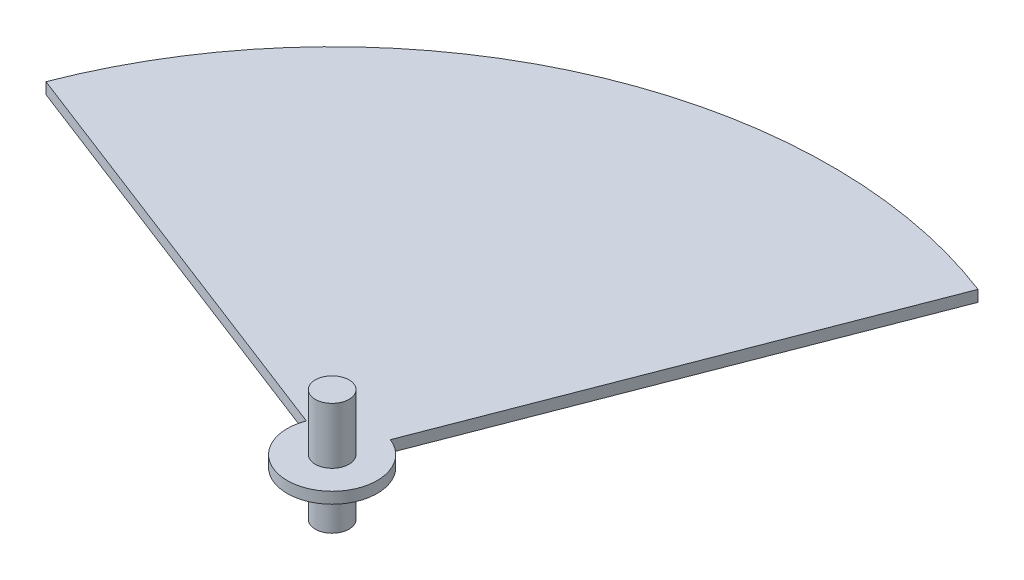
ISO-10303-21;
HEADER;
FILE_DESCRIPTION(('STEP AP214'),'2;1');
FILE_NAME('part.step','',(''),(''),'','','');
FILE_SCHEMA(('AUTOMOTIVE_DESIGN { 1 0 10303 214 1 1 1 1 }'));
ENDSEC;
DATA;
#1=APPLICATION_CONTEXT('core data for automotive mechanical design processes');
#2=APPLICATION_PROTOCOL_DEFINITION('international standard','automotive_design',2000,#1);
#3=PRODUCT_CONTEXT('',#1,'mechanical');
#4=PRODUCT('Part','Part','',(#3));
#5=PRODUCT_RELATED_PRODUCT_CATEGORY('part','',(#4));
#6=PRODUCT_DEFINITION_FORMATION('','',#4);
#7=PRODUCT_DEFINITION_CONTEXT('part definition',#1,'design');
#8=PRODUCT_DEFINITION('design','',#6,#7);
#9=PRODUCT_DEFINITION_SHAPE('','',#8);
#10=(LENGTH_UNIT() NAMED_UNIT(*) SI_UNIT(.MILLI.,.METRE.));
#11=(NAMED_UNIT(*) PLANE_ANGLE_UNIT() SI_UNIT($,.RADIAN.));
#12=(NAMED_UNIT(*) SI_UNIT($,.STERADIAN.) SOLID_ANGLE_UNIT());
#13=UNCERTAINTY_MEASURE_WITH_UNIT(LENGTH_MEASURE(1.E-05),#10,'distance_accuracy_value','');
#14=(GEOMETRIC_REPRESENTATION_CONTEXT(3) GLOBAL_UNCERTAINTY_ASSIGNED_CONTEXT((#13)) GLOBAL_UNIT_ASSIGNED_CONTEXT((#10,
#11,#12)) REPRESENTATION_CONTEXT('',''));
#15=CARTESIAN_POINT('',(0.,0.,0.));
#16=DIRECTION('',(0.,0.,1.));
#17=DIRECTION('',(1.,0.,0.));
#18=AXIS2_PLACEMENT_3D('',#15,#16,#17);
#19=CARTESIAN_POINT('',(225.,547.5,-225.));
#20=DIRECTION('',(0.,-1.,0.));
#21=DIRECTION('',(0.,0.,-1.));
#22=AXIS2_PLACEMENT_3D('',#19,#20,#21);
#23=CYLINDRICAL_SURFACE('',#22,7.50000000000001);
#24=CARTESIAN_POINT('',(225.,522.5,-225.));
#25=DIRECTION('',(0.,1.,0.));
#26=DIRECTION('',(0.,0.,1.));
#27=AXIS2_PLACEMENT_3D('',#24,#25,#26);
#28=CIRCLE('',#27,7.50000000000001);
#29=CARTESIAN_POINT('',(225.,522.5,-217.5));
#30=VERTEX_POINT('',#29);
#31=EDGE_CURVE('E43',#30,#30,#28,.T.);
#32=ORIENTED_EDGE('',*,*,#31,.T.);
#33=EDGE_LOOP('',(#32));
#34=FACE_BOUND('',#33,.T.);
#35=CARTESIAN_POINT('',(225.,547.5,-225.));
#36=DIRECTION('',(0.,1.,0.));
#37=DIRECTION('',(0.,0.,1.));
#38=AXIS2_PLACEMENT_3D('',#35,#36,#37);
#39=CIRCLE('',#38,7.50000000000001);
#40=CARTESIAN_POINT('',(225.,547.5,-217.5));
#41=VERTEX_POINT('',#40);
#42=EDGE_CURVE('E49',#41,#41,#39,.T.);
#43=ORIENTED_EDGE('',*,*,#42,.F.);
#44=EDGE_LOOP('',(#43));
#45=FACE_BOUND('',#44,.T.);
#46=ADVANCED_FACE('F40',(#34,#45),#23,.T.);
#47=CARTESIAN_POINT('',(225.,547.5,-225.));
#48=DIRECTION('',(0.,1.,0.));
#49=DIRECTION('',(0.,0.,1.));
#50=AXIS2_PLACEMENT_3D('',#47,#48,#49);
#51=PLANE('',#50);
#52=ORIENTED_EDGE('',*,*,#42,.T.);
#53=EDGE_LOOP('',(#52));
#54=FACE_BOUND('',#53,.T.);
#55=ADVANCED_FACE('F141',(#54),#51,.T.);
#56=CARTESIAN_POINT('',(225.,522.5,-225.));
#57=DIRECTION('',(0.,-1.,0.));
#58=DIRECTION('',(0.,0.,-1.));
#59=AXIS2_PLACEMENT_3D('',#56,#57,#58);
#60=CYLINDRICAL_SURFACE('',#59,222.);
#61=CARTESIAN_POINT('',(225.,517.5,-225.));
#62=DIRECTION('',(0.,1.,0.));
#63=DIRECTION('',(0.,0.,1.));
#64=AXIS2_PLACEMENT_3D('',#61,#62,#63);
#65=CIRCLE('',#64,222.);
#66=CARTESIAN_POINT('',(304.932555116059,517.5,-432.110566202254));
#67=VERTEX_POINT('',#66);
#68=CARTESIAN_POINT('',(17.8894333504933,517.5,-304.932553957197));
#69=VERTEX_POINT('',#68);
#70=EDGE_CURVE('E108',#67,#69,#65,.T.);
#71=ORIENTED_EDGE('',*,*,#70,.T.);
#72=DIRECTION('',(0.,-1.,0.));
#73=VECTOR('',#72,1.);
#74=CARTESIAN_POINT('',(17.8894333504933,522.5,-304.932553957197));
#75=LINE('',#74,#73);
#76=CARTESIAN_POINT('',(17.8894333504933,522.5,-304.932553957197));
#77=VERTEX_POINT('',#76);
#78=EDGE_CURVE('E99',#77,#69,#75,.T.);
#79=ORIENTED_EDGE('',*,*,#78,.F.);
#80=CARTESIAN_POINT('',(225.,522.5,-225.));
#81=DIRECTION('',(0.,1.,0.));
#82=DIRECTION('',(0.,0.,1.));
#83=AXIS2_PLACEMENT_3D('',#80,#81,#82);
#84=CIRCLE('',#83,222.);
#85=CARTESIAN_POINT('',(304.932555116059,522.5,-432.110566202254));
#86=VERTEX_POINT('',#85);
#87=EDGE_CURVE('E93',#86,#77,#84,.T.);
#88=ORIENTED_EDGE('',*,*,#87,.F.);
#89=DIRECTION('',(0.,-1.,0.));
#90=VECTOR('',#89,1.);
#91=CARTESIAN_POINT('',(304.932555116059,522.5,-432.110566202254));
#92=LINE('',#91,#90);
#93=EDGE_CURVE('E104',#86,#67,#92,.T.);
#94=ORIENTED_EDGE('',*,*,#93,.T.);
#95=EDGE_LOOP('',(#71,#79,#88,#94));
#96=FACE_BOUND('',#95,.T.);
#97=ADVANCED_FACE('F146',(#96),#60,.T.);
#98=CARTESIAN_POINT('',(206.341386692873,522.5,-232.201132414757));
#99=DIRECTION('',(0.360056549356744,0.,-0.932930480403183));
#100=DIRECTION('',(-0.932930480403183,0.,-0.360056549356744));
#101=AXIS2_PLACEMENT_3D('',#98,#99,#100);
#102=PLANE('',#101);
#103=DIRECTION('',(0.932930480403183,0.,0.360056549356744));
#104=VECTOR('',#103,1.);
#105=CARTESIAN_POINT('',(206.341386692873,517.5,-232.201132414757));
#106=LINE('',#105,#104);
#107=CARTESIAN_POINT('',(206.341386692873,517.5,-232.201132414757));
#108=VERTEX_POINT('',#107);
#109=EDGE_CURVE('E98',#69,#108,#106,.T.);
#110=ORIENTED_EDGE('',*,*,#109,.T.);
#111=DIRECTION('',(0.,-1.,0.));
#112=VECTOR('',#111,1.);
#113=CARTESIAN_POINT('',(206.341386692873,522.5,-232.201132414757));
#114=LINE('',#113,#112);
#115=CARTESIAN_POINT('',(206.341386692873,522.5,-232.201132414757));
#116=VERTEX_POINT('',#115);
#117=EDGE_CURVE('E96',#116,#108,#114,.T.);
#118=ORIENTED_EDGE('',*,*,#117,.F.);
#119=DIRECTION('',(0.932930480403183,0.,0.360056549356744));
#120=VECTOR('',#119,1.);
#121=CARTESIAN_POINT('',(206.341386692873,522.5,-232.201132414757));
#122=LINE('',#121,#120);
#123=EDGE_CURVE('E88',#77,#116,#122,.T.);
#124=ORIENTED_EDGE('',*,*,#123,.F.);
#125=ORIENTED_EDGE('',*,*,#78,.T.);
#126=EDGE_LOOP('',(#110,#118,#124,#125));
#127=FACE_BOUND('',#126,.T.);
#128=ADVANCED_FACE('F97',(#127),#102,.F.);
#129=CARTESIAN_POINT('',(225.,522.5,-225.));
#130=DIRECTION('',(0.,-1.,0.));
#131=DIRECTION('',(0.,0.,-1.));
#132=AXIS2_PLACEMENT_3D('',#129,#130,#131);
#133=CYLINDRICAL_SURFACE('',#132,20.0000039649945);
#134=CARTESIAN_POINT('',(225.,517.5,-225.));
#135=DIRECTION('',(0.,1.,0.));
#136=DIRECTION('',(0.,0.,1.));
#137=AXIS2_PLACEMENT_3D('',#134,#135,#136);
#138=CIRCLE('',#137,20.0000039649945);
#139=CARTESIAN_POINT('',(232.201132519159,517.5,-243.658613266835));
#140=VERTEX_POINT('',#139);
#141=EDGE_CURVE('E74',#108,#140,#138,.T.);
#142=ORIENTED_EDGE('',*,*,#141,.T.);
#143=DIRECTION('',(0.,-1.,0.));
#144=VECTOR('',#143,1.);
#145=CARTESIAN_POINT('',(232.201132519159,522.5,-243.658613266835));
#146=LINE('',#145,#144);
#147=CARTESIAN_POINT('',(232.201132519159,522.5,-243.658613266835));
#148=VERTEX_POINT('',#147);
#149=EDGE_CURVE('E100',#148,#140,#146,.T.);
#150=ORIENTED_EDGE('',*,*,#149,.F.);
#151=CARTESIAN_POINT('',(225.,522.5,-225.));
#152=DIRECTION('',(0.,1.,0.));
#153=DIRECTION('',(0.,0.,1.));
#154=AXIS2_PLACEMENT_3D('',#151,#152,#153);
#155=CIRCLE('',#154,20.0000039649945);
#156=EDGE_CURVE('E91',#116,#148,#155,.T.);
#157=ORIENTED_EDGE('',*,*,#156,.F.);
#158=ORIENTED_EDGE('',*,*,#117,.T.);
#159=EDGE_LOOP('',(#142,#150,#157,#158));
#160=FACE_BOUND('',#159,.T.);
#161=ADVANCED_FACE('F102',(#160),#133,.T.);
#162=CARTESIAN_POINT('',(232.201132519159,522.5,-243.658613266836));
#163=DIRECTION('',(-0.93293047838853,0.,-0.360056554576844));
#164=DIRECTION('',(-0.360056554576844,0.,0.93293047838853));
#165=AXIS2_PLACEMENT_3D('',#162,#163,#164);
#166=PLANE('',#165);
#167=DIRECTION('',(0.360056554576844,0.,-0.93293047838853));
#168=VECTOR('',#167,1.);
#169=CARTESIAN_POINT('',(232.201132519159,517.5,-243.658613266836));
#170=LINE('',#169,#168);
#171=EDGE_CURVE('E80',#140,#67,#170,.T.);
#172=ORIENTED_EDGE('',*,*,#171,.T.);
#173=ORIENTED_EDGE('',*,*,#93,.F.);
#174=DIRECTION('',(0.360056554576844,0.,-0.93293047838853));
#175=VECTOR('',#174,1.);
#176=CARTESIAN_POINT('',(232.201132519159,522.5,-243.658613266836));
#177=LINE('',#176,#175);
#178=EDGE_CURVE('E57',#148,#86,#177,.T.);
#179=ORIENTED_EDGE('',*,*,#178,.F.);
#180=ORIENTED_EDGE('',*,*,#149,.T.);
#181=EDGE_LOOP('',(#172,#173,#179,#180));
#182=FACE_BOUND('',#181,.T.);
#183=ADVANCED_FACE('F130',(#182),#166,.F.);
#184=CARTESIAN_POINT('',(225.,522.5,-225.));
#185=DIRECTION('',(0.,1.,0.));
#186=DIRECTION('',(0.,0.,1.));
#187=AXIS2_PLACEMENT_3D('',#184,#185,#186);
#188=PLANE('',#187);
#189=ORIENTED_EDGE('',*,*,#31,.F.);
#190=EDGE_LOOP('',(#189));
#191=FACE_BOUND('',#190,.T.);
#192=ORIENTED_EDGE('',*,*,#87,.T.);
#193=ORIENTED_EDGE('',*,*,#123,.T.);
#194=ORIENTED_EDGE('',*,*,#156,.T.);
#195=ORIENTED_EDGE('',*,*,#178,.T.);
#196=EDGE_LOOP('',(#192,#193,#194,#195));
#197=FACE_BOUND('',#196,.T.);
#198=ADVANCED_FACE('F89',(#191,#197),#188,.T.);
#199=CARTESIAN_POINT('',(225.,517.5,-225.));
#200=DIRECTION('',(0.,1.,0.));
#201=DIRECTION('',(0.,0.,1.));
#202=AXIS2_PLACEMENT_3D('',#199,#200,#201);
#203=PLANE('',#202);
#204=CARTESIAN_POINT('',(225.,517.5,-225.));
#205=DIRECTION('',(0.,1.,0.));
#206=DIRECTION('',(0.,0.,1.));
#207=AXIS2_PLACEMENT_3D('',#204,#205,#206);
#208=CIRCLE('',#207,7.50000000000001);
#209=CARTESIAN_POINT('',(225.,517.5,-217.5));
#210=VERTEX_POINT('',#209);
#211=EDGE_CURVE('E11',#210,#210,#208,.T.);
#212=ORIENTED_EDGE('',*,*,#211,.T.);
#213=EDGE_LOOP('',(#212));
#214=FACE_BOUND('',#213,.T.);
#215=ORIENTED_EDGE('',*,*,#70,.F.);
#216=ORIENTED_EDGE('',*,*,#171,.F.);
#217=ORIENTED_EDGE('',*,*,#141,.F.);
#218=ORIENTED_EDGE('',*,*,#109,.F.);
#219=EDGE_LOOP('',(#215,#216,#217,#218));
#220=FACE_BOUND('',#219,.T.);
#221=ADVANCED_FACE('F129',(#214,#220),#203,.F.);
#222=CARTESIAN_POINT('',(225.,497.5,-225.));
#223=DIRECTION('',(0.,1.,0.));
#224=DIRECTION('',(0.,0.,1.));
#225=AXIS2_PLACEMENT_3D('',#222,#223,#224);
#226=PLANE('',#225);
#227=CARTESIAN_POINT('',(225.,497.5,-225.));
#228=DIRECTION('',(0.,1.,0.));
#229=DIRECTION('',(0.,0.,1.));
#230=AXIS2_PLACEMENT_3D('',#227,#228,#229);
#231=CIRCLE('',#230,7.50000000000001);
#232=CARTESIAN_POINT('',(225.,497.5,-217.5));
#233=VERTEX_POINT('',#232);
#234=EDGE_CURVE('E119',#233,#233,#231,.T.);
#235=ORIENTED_EDGE('',*,*,#234,.F.);
#236=EDGE_LOOP('',(#235));
#237=FACE_BOUND('',#236,.T.);
#238=ADVANCED_FACE('F136',(#237),#226,.F.);
#239=ORIENTED_EDGE('',*,*,#234,.T.);
#240=EDGE_LOOP('',(#239));
#241=FACE_BOUND('',#240,.T.);
#242=ORIENTED_EDGE('',*,*,#211,.F.);
#243=EDGE_LOOP('',(#242));
#244=FACE_BOUND('',#243,.T.);
#245=ADVANCED_FACE('F142',(#241,#244),#23,.T.);
#246=CLOSED_SHELL('',(#46,#55,#97,#128,#161,#183,#198,#221,#238,#245));
#247=MANIFOLD_SOLID_BREP('B2',#246);
#248=ADVANCED_BREP_SHAPE_REPRESENTATION('',(#18,#247),#14);
#249=SHAPE_DEFINITION_REPRESENTATION(#9,#248);
ENDSEC;
END-ISO-10303-21;
